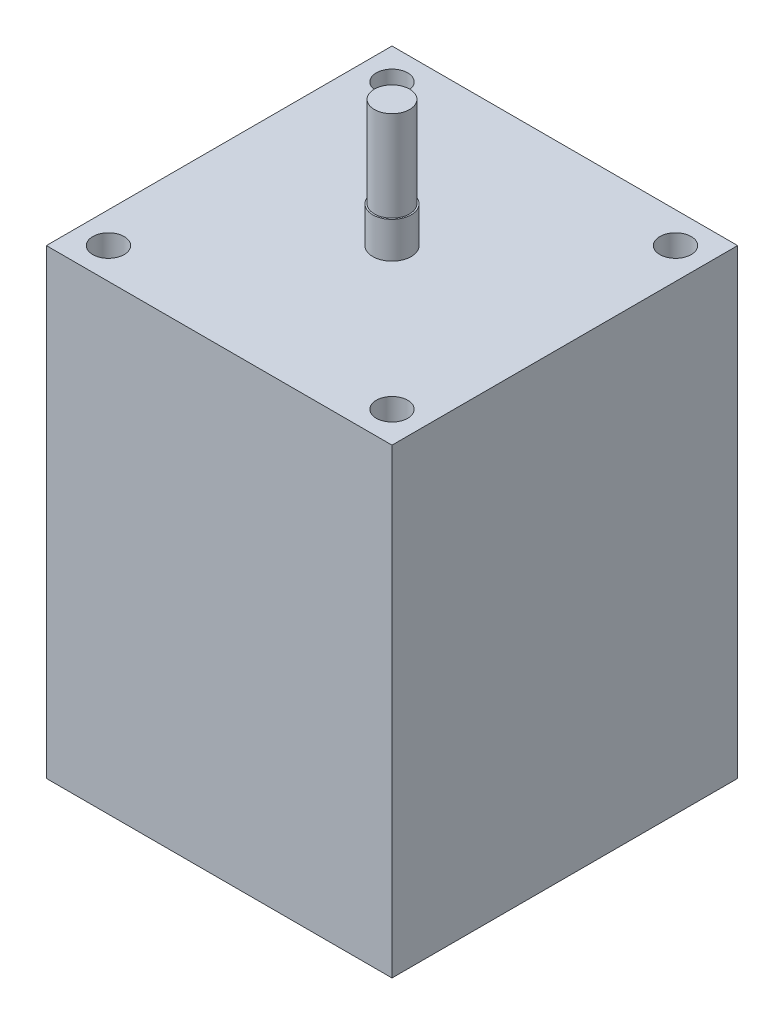
ISO-10303-21;
HEADER;
FILE_DESCRIPTION(('STEP AP214'),'2;1');
FILE_NAME('part.step','',(''),(''),'','','');
FILE_SCHEMA(('AUTOMOTIVE_DESIGN { 1 0 10303 214 1 1 1 1 }'));
ENDSEC;
DATA;
#1=APPLICATION_CONTEXT('core data for automotive mechanical design processes');
#2=APPLICATION_PROTOCOL_DEFINITION('international standard','automotive_design',2000,#1);
#3=PRODUCT_CONTEXT('',#1,'mechanical');
#4=PRODUCT('Part','Part','',(#3));
#5=PRODUCT_RELATED_PRODUCT_CATEGORY('part','',(#4));
#6=PRODUCT_DEFINITION_FORMATION('','',#4);
#7=PRODUCT_DEFINITION_CONTEXT('part definition',#1,'design');
#8=PRODUCT_DEFINITION('design','',#6,#7);
#9=PRODUCT_DEFINITION_SHAPE('','',#8);
#10=(LENGTH_UNIT() NAMED_UNIT(*) SI_UNIT(.MILLI.,.METRE.));
#11=(NAMED_UNIT(*) PLANE_ANGLE_UNIT() SI_UNIT($,.RADIAN.));
#12=(NAMED_UNIT(*) SI_UNIT($,.STERADIAN.) SOLID_ANGLE_UNIT());
#13=UNCERTAINTY_MEASURE_WITH_UNIT(LENGTH_MEASURE(1.E-05),#10,'distance_accuracy_value','');
#14=(GEOMETRIC_REPRESENTATION_CONTEXT(3) GLOBAL_UNCERTAINTY_ASSIGNED_CONTEXT((#13)) GLOBAL_UNIT_ASSIGNED_CONTEXT((#10,
#11,#12)) REPRESENTATION_CONTEXT('',''));
#15=CARTESIAN_POINT('',(0.,0.,0.));
#16=DIRECTION('',(0.,0.,1.));
#17=DIRECTION('',(1.,0.,0.));
#18=AXIS2_PLACEMENT_3D('',#15,#16,#17);
#19=CARTESIAN_POINT('',(57.2999999999999,76.5,0.));
#20=DIRECTION('',(1.,0.,0.));
#21=DIRECTION('',(0.,0.,-1.));
#22=AXIS2_PLACEMENT_3D('',#19,#20,#21);
#23=PLANE('',#22);
#24=DIRECTION('',(0.,0.,1.));
#25=VECTOR('',#24,1.);
#26=CARTESIAN_POINT('',(57.2999999999999,0.,0.));
#27=LINE('',#26,#25);
#28=CARTESIAN_POINT('',(57.2999999999999,0.,0.));
#29=VERTEX_POINT('',#28);
#30=CARTESIAN_POINT('',(57.2999999999999,0.,57.3));
#31=VERTEX_POINT('',#30);
#32=EDGE_CURVE('E116',#29,#31,#27,.T.);
#33=ORIENTED_EDGE('',*,*,#32,.F.);
#34=DIRECTION('',(0.,-1.,0.));
#35=VECTOR('',#34,1.);
#36=CARTESIAN_POINT('',(57.2999999999999,76.5,0.));
#37=LINE('',#36,#35);
#38=CARTESIAN_POINT('',(57.2999999999999,76.5,0.));
#39=VERTEX_POINT('',#38);
#40=EDGE_CURVE('E11',#39,#29,#37,.T.);
#41=ORIENTED_EDGE('',*,*,#40,.F.);
#42=DIRECTION('',(0.,0.,1.));
#43=VECTOR('',#42,1.);
#44=CARTESIAN_POINT('',(57.2999999999999,76.5,0.));
#45=LINE('',#44,#43);
#46=CARTESIAN_POINT('',(57.2999999999999,76.5,57.3));
#47=VERTEX_POINT('',#46);
#48=EDGE_CURVE('E96',#39,#47,#45,.T.);
#49=ORIENTED_EDGE('',*,*,#48,.T.);
#50=DIRECTION('',(0.,-1.,0.));
#51=VECTOR('',#50,1.);
#52=CARTESIAN_POINT('',(57.2999999999999,76.5,57.3));
#53=LINE('',#52,#51);
#54=EDGE_CURVE('E75',#47,#31,#53,.T.);
#55=ORIENTED_EDGE('',*,*,#54,.T.);
#56=EDGE_LOOP('',(#33,#41,#49,#55));
#57=FACE_BOUND('',#56,.T.);
#58=ADVANCED_FACE('F35',(#57),#23,.T.);
#59=CARTESIAN_POINT('',(0.,76.5,0.));
#60=DIRECTION('',(0.,0.,-1.));
#61=DIRECTION('',(-1.,0.,0.));
#62=AXIS2_PLACEMENT_3D('',#59,#60,#61);
#63=PLANE('',#62);
#64=DIRECTION('',(1.,0.,0.));
#65=VECTOR('',#64,1.);
#66=CARTESIAN_POINT('',(0.,0.,0.));
#67=LINE('',#66,#65);
#68=CARTESIAN_POINT('',(0.,0.,0.));
#69=VERTEX_POINT('',#68);
#70=EDGE_CURVE('E87',#69,#29,#67,.T.);
#71=ORIENTED_EDGE('',*,*,#70,.F.);
#72=DIRECTION('',(0.,-1.,0.));
#73=VECTOR('',#72,1.);
#74=CARTESIAN_POINT('',(0.,76.5,0.));
#75=LINE('',#74,#73);
#76=CARTESIAN_POINT('',(0.,76.5,0.));
#77=VERTEX_POINT('',#76);
#78=EDGE_CURVE('E44',#77,#69,#75,.T.);
#79=ORIENTED_EDGE('',*,*,#78,.F.);
#80=DIRECTION('',(1.,0.,0.));
#81=VECTOR('',#80,1.);
#82=CARTESIAN_POINT('',(0.,76.5,0.));
#83=LINE('',#82,#81);
#84=EDGE_CURVE('E85',#77,#39,#83,.T.);
#85=ORIENTED_EDGE('',*,*,#84,.T.);
#86=ORIENTED_EDGE('',*,*,#40,.T.);
#87=EDGE_LOOP('',(#71,#79,#85,#86));
#88=FACE_BOUND('',#87,.T.);
#89=ADVANCED_FACE('F83',(#88),#63,.T.);
#90=CARTESIAN_POINT('',(0.,76.5,0.));
#91=DIRECTION('',(1.,0.,0.));
#92=DIRECTION('',(0.,0.,-1.));
#93=AXIS2_PLACEMENT_3D('',#90,#91,#92);
#94=PLANE('',#93);
#95=DIRECTION('',(0.,0.,1.));
#96=VECTOR('',#95,1.);
#97=CARTESIAN_POINT('',(0.,0.,0.));
#98=LINE('',#97,#96);
#99=CARTESIAN_POINT('',(0.,0.,57.2999999999999));
#100=VERTEX_POINT('',#99);
#101=EDGE_CURVE('E119',#69,#100,#98,.T.);
#102=ORIENTED_EDGE('',*,*,#101,.T.);
#103=DIRECTION('',(0.,-1.,0.));
#104=VECTOR('',#103,1.);
#105=CARTESIAN_POINT('',(0.,76.5,57.2999999999999));
#106=LINE('',#105,#104);
#107=CARTESIAN_POINT('',(0.,76.5,57.2999999999999));
#108=VERTEX_POINT('',#107);
#109=EDGE_CURVE('E90',#108,#100,#106,.T.);
#110=ORIENTED_EDGE('',*,*,#109,.F.);
#111=DIRECTION('',(0.,0.,1.));
#112=VECTOR('',#111,1.);
#113=CARTESIAN_POINT('',(0.,76.5,0.));
#114=LINE('',#113,#112);
#115=EDGE_CURVE('E92',#77,#108,#114,.T.);
#116=ORIENTED_EDGE('',*,*,#115,.F.);
#117=ORIENTED_EDGE('',*,*,#78,.T.);
#118=EDGE_LOOP('',(#102,#110,#116,#117));
#119=FACE_BOUND('',#118,.T.);
#120=ADVANCED_FACE('F93',(#119),#94,.F.);
#121=CARTESIAN_POINT('',(5.15,76.5,5.15));
#122=DIRECTION('',(0.,-1.,0.));
#123=DIRECTION('',(0.,0.,-1.));
#124=AXIS2_PLACEMENT_3D('',#121,#122,#123);
#125=CYLINDRICAL_SURFACE('',#124,2.6);
#126=CARTESIAN_POINT('',(5.15,76.5,5.15));
#127=DIRECTION('',(0.,1.,0.));
#128=DIRECTION('',(0.,0.,1.));
#129=AXIS2_PLACEMENT_3D('',#126,#127,#128);
#130=CIRCLE('',#129,2.6);
#131=CARTESIAN_POINT('',(5.15,76.5,7.75));
#132=VERTEX_POINT('',#131);
#133=EDGE_CURVE('E98',#132,#132,#130,.T.);
#134=ORIENTED_EDGE('',*,*,#133,.T.);
#135=EDGE_LOOP('',(#134));
#136=FACE_BOUND('',#135,.T.);
#137=CARTESIAN_POINT('',(5.15,0.,5.15));
#138=DIRECTION('',(0.,1.,0.));
#139=DIRECTION('',(0.,0.,1.));
#140=AXIS2_PLACEMENT_3D('',#137,#138,#139);
#141=CIRCLE('',#140,2.6);
#142=CARTESIAN_POINT('',(5.15,0.,7.75));
#143=VERTEX_POINT('',#142);
#144=EDGE_CURVE('E113',#143,#143,#141,.T.);
#145=ORIENTED_EDGE('',*,*,#144,.F.);
#146=EDGE_LOOP('',(#145));
#147=FACE_BOUND('',#146,.T.);
#148=ADVANCED_FACE('F135',(#136,#147),#125,.F.);
#149=CARTESIAN_POINT('',(52.15,76.5,5.15));
#150=DIRECTION('',(0.,-1.,0.));
#151=DIRECTION('',(0.,0.,-1.));
#152=AXIS2_PLACEMENT_3D('',#149,#150,#151);
#153=CYLINDRICAL_SURFACE('',#152,2.6);
#154=CARTESIAN_POINT('',(52.15,76.5,5.15));
#155=DIRECTION('',(0.,1.,0.));
#156=DIRECTION('',(0.,0.,1.));
#157=AXIS2_PLACEMENT_3D('',#154,#155,#156);
#158=CIRCLE('',#157,2.6);
#159=CARTESIAN_POINT('',(52.15,76.5,7.75));
#160=VERTEX_POINT('',#159);
#161=EDGE_CURVE('E274',#160,#160,#158,.T.);
#162=ORIENTED_EDGE('',*,*,#161,.T.);
#163=EDGE_LOOP('',(#162));
#164=FACE_BOUND('',#163,.T.);
#165=CARTESIAN_POINT('',(52.15,0.,5.15));
#166=DIRECTION('',(0.,1.,0.));
#167=DIRECTION('',(0.,0.,1.));
#168=AXIS2_PLACEMENT_3D('',#165,#166,#167);
#169=CIRCLE('',#168,2.6);
#170=CARTESIAN_POINT('',(52.15,0.,7.75));
#171=VERTEX_POINT('',#170);
#172=EDGE_CURVE('E110',#171,#171,#169,.T.);
#173=ORIENTED_EDGE('',*,*,#172,.F.);
#174=EDGE_LOOP('',(#173));
#175=FACE_BOUND('',#174,.T.);
#176=ADVANCED_FACE('F138',(#164,#175),#153,.F.);
#177=CARTESIAN_POINT('',(5.15,76.5,52.15));
#178=DIRECTION('',(0.,-1.,0.));
#179=DIRECTION('',(0.,0.,-1.));
#180=AXIS2_PLACEMENT_3D('',#177,#178,#179);
#181=CYLINDRICAL_SURFACE('',#180,2.60000000000001);
#182=CARTESIAN_POINT('',(5.15,76.5,52.15));
#183=DIRECTION('',(0.,1.,0.));
#184=DIRECTION('',(0.,0.,1.));
#185=AXIS2_PLACEMENT_3D('',#182,#183,#184);
#186=CIRCLE('',#185,2.60000000000001);
#187=CARTESIAN_POINT('',(5.15,76.5,54.75));
#188=VERTEX_POINT('',#187);
#189=EDGE_CURVE('E152',#188,#188,#186,.T.);
#190=ORIENTED_EDGE('',*,*,#189,.T.);
#191=EDGE_LOOP('',(#190));
#192=FACE_BOUND('',#191,.T.);
#193=CARTESIAN_POINT('',(5.15,0.,52.15));
#194=DIRECTION('',(0.,1.,0.));
#195=DIRECTION('',(0.,0.,1.));
#196=AXIS2_PLACEMENT_3D('',#193,#194,#195);
#197=CIRCLE('',#196,2.60000000000001);
#198=CARTESIAN_POINT('',(5.15,0.,54.75));
#199=VERTEX_POINT('',#198);
#200=EDGE_CURVE('E106',#199,#199,#197,.T.);
#201=ORIENTED_EDGE('',*,*,#200,.F.);
#202=EDGE_LOOP('',(#201));
#203=FACE_BOUND('',#202,.T.);
#204=ADVANCED_FACE('F141',(#192,#203),#181,.F.);
#205=CARTESIAN_POINT('',(52.15,76.5,52.15));
#206=DIRECTION('',(0.,-1.,0.));
#207=DIRECTION('',(0.,0.,-1.));
#208=AXIS2_PLACEMENT_3D('',#205,#206,#207);
#209=CYLINDRICAL_SURFACE('',#208,2.6);
#210=CARTESIAN_POINT('',(52.15,76.5,52.15));
#211=DIRECTION('',(0.,1.,0.));
#212=DIRECTION('',(0.,0.,1.));
#213=AXIS2_PLACEMENT_3D('',#210,#211,#212);
#214=CIRCLE('',#213,2.6);
#215=CARTESIAN_POINT('',(52.15,76.5,54.75));
#216=VERTEX_POINT('',#215);
#217=EDGE_CURVE('E270',#216,#216,#214,.T.);
#218=ORIENTED_EDGE('',*,*,#217,.T.);
#219=EDGE_LOOP('',(#218));
#220=FACE_BOUND('',#219,.T.);
#221=CARTESIAN_POINT('',(52.15,0.,52.15));
#222=DIRECTION('',(0.,1.,0.));
#223=DIRECTION('',(0.,0.,1.));
#224=AXIS2_PLACEMENT_3D('',#221,#222,#223);
#225=CIRCLE('',#224,2.6);
#226=CARTESIAN_POINT('',(52.15,0.,54.75));
#227=VERTEX_POINT('',#226);
#228=EDGE_CURVE('E103',#227,#227,#225,.T.);
#229=ORIENTED_EDGE('',*,*,#228,.F.);
#230=EDGE_LOOP('',(#229));
#231=FACE_BOUND('',#230,.T.);
#232=ADVANCED_FACE('F37',(#220,#231),#209,.F.);
#233=CARTESIAN_POINT('',(0.,76.5,57.2999999999999));
#234=DIRECTION('',(0.,0.,-1.));
#235=DIRECTION('',(-1.,0.,0.));
#236=AXIS2_PLACEMENT_3D('',#233,#234,#235);
#237=PLANE('',#236);
#238=DIRECTION('',(1.,0.,0.));
#239=VECTOR('',#238,1.);
#240=CARTESIAN_POINT('',(0.,0.,57.2999999999999));
#241=LINE('',#240,#239);
#242=EDGE_CURVE('E68',#100,#31,#241,.T.);
#243=ORIENTED_EDGE('',*,*,#242,.T.);
#244=ORIENTED_EDGE('',*,*,#54,.F.);
#245=DIRECTION('',(1.,0.,0.));
#246=VECTOR('',#245,1.);
#247=CARTESIAN_POINT('',(0.,76.5,57.2999999999999));
#248=LINE('',#247,#246);
#249=EDGE_CURVE('E52',#108,#47,#248,.T.);
#250=ORIENTED_EDGE('',*,*,#249,.F.);
#251=ORIENTED_EDGE('',*,*,#109,.T.);
#252=EDGE_LOOP('',(#243,#244,#250,#251));
#253=FACE_BOUND('',#252,.T.);
#254=ADVANCED_FACE('F125',(#253),#237,.F.);
#255=CARTESIAN_POINT('',(0.,76.5,0.));
#256=DIRECTION('',(0.,1.,0.));
#257=DIRECTION('',(0.,0.,1.));
#258=AXIS2_PLACEMENT_3D('',#255,#256,#257);
#259=PLANE('',#258);
#260=CARTESIAN_POINT('',(28.65,76.5,28.65));
#261=DIRECTION('',(0.,1.,0.));
#262=DIRECTION('',(0.,0.,1.));
#263=AXIS2_PLACEMENT_3D('',#260,#261,#262);
#264=CIRCLE('',#263,3.175);
#265=CARTESIAN_POINT('',(28.65,76.5,31.825));
#266=VERTEX_POINT('',#265);
#267=EDGE_CURVE('E122',#266,#266,#264,.T.);
#268=ORIENTED_EDGE('',*,*,#267,.F.);
#269=EDGE_LOOP('',(#268));
#270=FACE_BOUND('',#269,.T.);
#271=ORIENTED_EDGE('',*,*,#217,.F.);
#272=EDGE_LOOP('',(#271));
#273=FACE_BOUND('',#272,.T.);
#274=ORIENTED_EDGE('',*,*,#189,.F.);
#275=EDGE_LOOP('',(#274));
#276=FACE_BOUND('',#275,.T.);
#277=ORIENTED_EDGE('',*,*,#161,.F.);
#278=EDGE_LOOP('',(#277));
#279=FACE_BOUND('',#278,.T.);
#280=ORIENTED_EDGE('',*,*,#133,.F.);
#281=EDGE_LOOP('',(#280));
#282=FACE_BOUND('',#281,.T.);
#283=ORIENTED_EDGE('',*,*,#48,.F.);
#284=ORIENTED_EDGE('',*,*,#84,.F.);
#285=ORIENTED_EDGE('',*,*,#115,.T.);
#286=ORIENTED_EDGE('',*,*,#249,.T.);
#287=EDGE_LOOP('',(#283,#284,#285,#286));
#288=FACE_BOUND('',#287,.T.);
#289=ADVANCED_FACE('F95',(#270,#273,#276,#279,#282,#288),#259,.T.);
#290=CARTESIAN_POINT('',(0.,0.,0.));
#291=DIRECTION('',(0.,1.,0.));
#292=DIRECTION('',(0.,0.,1.));
#293=AXIS2_PLACEMENT_3D('',#290,#291,#292);
#294=PLANE('',#293);
#295=ORIENTED_EDGE('',*,*,#228,.T.);
#296=EDGE_LOOP('',(#295));
#297=FACE_BOUND('',#296,.T.);
#298=ORIENTED_EDGE('',*,*,#200,.T.);
#299=EDGE_LOOP('',(#298));
#300=FACE_BOUND('',#299,.T.);
#301=ORIENTED_EDGE('',*,*,#172,.T.);
#302=EDGE_LOOP('',(#301));
#303=FACE_BOUND('',#302,.T.);
#304=ORIENTED_EDGE('',*,*,#144,.T.);
#305=EDGE_LOOP('',(#304));
#306=FACE_BOUND('',#305,.T.);
#307=ORIENTED_EDGE('',*,*,#32,.T.);
#308=ORIENTED_EDGE('',*,*,#242,.F.);
#309=ORIENTED_EDGE('',*,*,#101,.F.);
#310=ORIENTED_EDGE('',*,*,#70,.T.);
#311=EDGE_LOOP('',(#307,#308,#309,#310));
#312=FACE_BOUND('',#311,.T.);
#313=ADVANCED_FACE('F126',(#297,#300,#303,#306,#312),#294,.F.);
#314=CARTESIAN_POINT('',(28.65,82.5,28.65));
#315=DIRECTION('',(0.,-1.,0.));
#316=DIRECTION('',(0.,0.,-1.));
#317=AXIS2_PLACEMENT_3D('',#314,#315,#316);
#318=CYLINDRICAL_SURFACE('',#317,3.175);
#319=ORIENTED_EDGE('',*,*,#267,.T.);
#320=EDGE_LOOP('',(#319));
#321=FACE_BOUND('',#320,.T.);
#322=CARTESIAN_POINT('',(28.65,82.5,28.65));
#323=DIRECTION('',(0.,1.,0.));
#324=DIRECTION('',(0.,0.,1.));
#325=AXIS2_PLACEMENT_3D('',#322,#323,#324);
#326=CIRCLE('',#325,3.175);
#327=CARTESIAN_POINT('',(28.65,82.5,31.825));
#328=VERTEX_POINT('',#327);
#329=EDGE_CURVE('E107',#328,#328,#326,.T.);
#330=ORIENTED_EDGE('',*,*,#329,.F.);
#331=EDGE_LOOP('',(#330));
#332=FACE_BOUND('',#331,.T.);
#333=ADVANCED_FACE('F157',(#321,#332),#318,.T.);
#334=CARTESIAN_POINT('',(0.,82.5,0.));
#335=DIRECTION('',(0.,1.,0.));
#336=DIRECTION('',(0.,0.,1.));
#337=AXIS2_PLACEMENT_3D('',#334,#335,#336);
#338=PLANE('',#337);
#339=CARTESIAN_POINT('',(28.65,82.5,28.65));
#340=DIRECTION('',(0.,1.,0.));
#341=DIRECTION('',(0.,0.,1.));
#342=AXIS2_PLACEMENT_3D('',#339,#340,#341);
#343=CIRCLE('',#342,2.925);
#344=CARTESIAN_POINT('',(28.65,82.5,31.575));
#345=VERTEX_POINT('',#344);
#346=EDGE_CURVE('E259',#345,#345,#343,.T.);
#347=ORIENTED_EDGE('',*,*,#346,.F.);
#348=EDGE_LOOP('',(#347));
#349=FACE_BOUND('',#348,.T.);
#350=ORIENTED_EDGE('',*,*,#329,.T.);
#351=EDGE_LOOP('',(#350));
#352=FACE_BOUND('',#351,.T.);
#353=ADVANCED_FACE('F169',(#349,#352),#338,.T.);
#354=CARTESIAN_POINT('',(0.,97.5,0.));
#355=DIRECTION('',(0.,1.,0.));
#356=DIRECTION('',(0.,0.,1.));
#357=AXIS2_PLACEMENT_3D('',#354,#355,#356);
#358=PLANE('',#357);
#359=CARTESIAN_POINT('',(28.65,97.5,28.65));
#360=DIRECTION('',(0.,1.,0.));
#361=DIRECTION('',(0.,0.,1.));
#362=AXIS2_PLACEMENT_3D('',#359,#360,#361);
#363=CIRCLE('',#362,2.925);
#364=CARTESIAN_POINT('',(28.65,97.5,31.575));
#365=VERTEX_POINT('',#364);
#366=EDGE_CURVE('E262',#365,#365,#363,.T.);
#367=ORIENTED_EDGE('',*,*,#366,.T.);
#368=EDGE_LOOP('',(#367));
#369=FACE_BOUND('',#368,.T.);
#370=ADVANCED_FACE('F227',(#369),#358,.T.);
#371=CARTESIAN_POINT('',(28.65,97.5,28.65));
#372=DIRECTION('',(0.,-1.,0.));
#373=DIRECTION('',(0.,0.,-1.));
#374=AXIS2_PLACEMENT_3D('',#371,#372,#373);
#375=CYLINDRICAL_SURFACE('',#374,2.925);
#376=ORIENTED_EDGE('',*,*,#346,.T.);
#377=EDGE_LOOP('',(#376));
#378=FACE_BOUND('',#377,.T.);
#379=ORIENTED_EDGE('',*,*,#366,.F.);
#380=EDGE_LOOP('',(#379));
#381=FACE_BOUND('',#380,.T.);
#382=ADVANCED_FACE('F242',(#378,#381),#375,.T.);
#383=CLOSED_SHELL('',(#58,#89,#120,#148,#176,#204,#232,#254,#289,#313,#333,#353,#370,#382));
#384=MANIFOLD_SOLID_BREP('B2',#383);
#385=ADVANCED_BREP_SHAPE_REPRESENTATION('',(#18,#384),#14);
#386=SHAPE_DEFINITION_REPRESENTATION(#9,#385);
ENDSEC;
END-ISO-10303-21;
